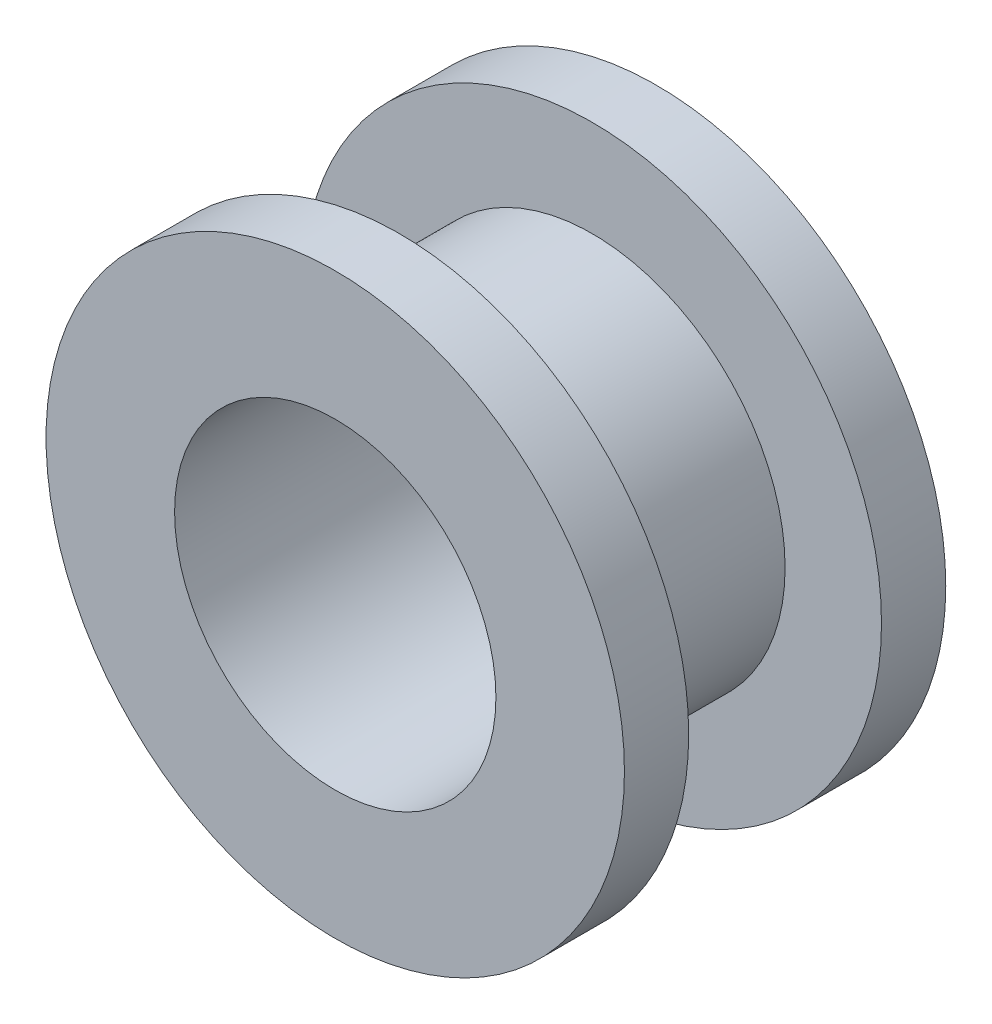
ISO-10303-21;
HEADER;
FILE_DESCRIPTION(('STEP AP214'),'2;1');
FILE_NAME('part.step','',(''),(''),'','','');
FILE_SCHEMA(('AUTOMOTIVE_DESIGN { 1 0 10303 214 1 1 1 1 }'));
ENDSEC;
DATA;
#1=APPLICATION_CONTEXT('core data for automotive mechanical design processes');
#2=APPLICATION_PROTOCOL_DEFINITION('international standard','automotive_design',2000,#1);
#3=PRODUCT_CONTEXT('',#1,'mechanical');
#4=PRODUCT('Part','Part','',(#3));
#5=PRODUCT_RELATED_PRODUCT_CATEGORY('part','',(#4));
#6=PRODUCT_DEFINITION_FORMATION('','',#4);
#7=PRODUCT_DEFINITION_CONTEXT('part definition',#1,'design');
#8=PRODUCT_DEFINITION('design','',#6,#7);
#9=PRODUCT_DEFINITION_SHAPE('','',#8);
#10=(LENGTH_UNIT() NAMED_UNIT(*) SI_UNIT(.MILLI.,.METRE.));
#11=(NAMED_UNIT(*) PLANE_ANGLE_UNIT() SI_UNIT($,.RADIAN.));
#12=(NAMED_UNIT(*) SI_UNIT($,.STERADIAN.) SOLID_ANGLE_UNIT());
#13=UNCERTAINTY_MEASURE_WITH_UNIT(LENGTH_MEASURE(1.E-05),#10,'distance_accuracy_value','');
#14=(GEOMETRIC_REPRESENTATION_CONTEXT(3) GLOBAL_UNCERTAINTY_ASSIGNED_CONTEXT((#13)) GLOBAL_UNIT_ASSIGNED_CONTEXT((#10,
#11,#12)) REPRESENTATION_CONTEXT('',''));
#15=CARTESIAN_POINT('',(0.,0.,0.));
#16=DIRECTION('',(0.,0.,1.));
#17=DIRECTION('',(1.,0.,0.));
#18=AXIS2_PLACEMENT_3D('',#15,#16,#17);
#19=CARTESIAN_POINT('',(-4.92551999338994E-12,118.250000000001,26.9705627484773));
#20=DIRECTION('',(0.,0.,-1.));
#21=DIRECTION('',(-1.,0.,0.));
#22=AXIS2_PLACEMENT_3D('',#19,#20,#21);
#23=CYLINDRICAL_SURFACE('',#22,6.);
#24=CARTESIAN_POINT('',(-4.92551999338994E-12,118.250000000001,2.));
#25=DIRECTION('',(0.,0.,1.));
#26=DIRECTION('',(1.,0.,0.));
#27=AXIS2_PLACEMENT_3D('',#24,#25,#26);
#28=CIRCLE('',#27,6.);
#29=CARTESIAN_POINT('',(5.99999999999508,118.250000000001,2.));
#30=VERTEX_POINT('',#29);
#31=EDGE_CURVE('E54',#30,#30,#28,.T.);
#32=ORIENTED_EDGE('',*,*,#31,.T.);
#33=EDGE_LOOP('',(#32));
#34=FACE_BOUND('',#33,.T.);
#35=CARTESIAN_POINT('',(-4.92551999338994E-12,118.250000000001,8.00000000000013));
#36=DIRECTION('',(0.,0.,1.));
#37=DIRECTION('',(1.,0.,0.));
#38=AXIS2_PLACEMENT_3D('',#35,#36,#37);
#39=CIRCLE('',#38,6.);
#40=CARTESIAN_POINT('',(5.99999999999508,118.250000000001,8.00000000000013));
#41=VERTEX_POINT('',#40);
#42=EDGE_CURVE('E10',#41,#41,#39,.T.);
#43=ORIENTED_EDGE('',*,*,#42,.F.);
#44=EDGE_LOOP('',(#43));
#45=FACE_BOUND('',#44,.T.);
#46=ADVANCED_FACE('F31',(#34,#45),#23,.T.);
#47=CARTESIAN_POINT('',(-4.92551999338994E-12,118.250000000001,2.));
#48=DIRECTION('',(0.,0.,1.));
#49=DIRECTION('',(1.,0.,0.));
#50=AXIS2_PLACEMENT_3D('',#47,#48,#49);
#51=PLANE('',#50);
#52=CARTESIAN_POINT('',(-4.92551999338994E-12,118.250000000001,2.));
#53=DIRECTION('',(0.,0.,1.));
#54=DIRECTION('',(1.,0.,0.));
#55=AXIS2_PLACEMENT_3D('',#52,#53,#54);
#56=CIRCLE('',#55,9.);
#57=CARTESIAN_POINT('',(8.99999999999507,118.250000000001,2.));
#58=VERTEX_POINT('',#57);
#59=EDGE_CURVE('E38',#58,#58,#56,.T.);
#60=ORIENTED_EDGE('',*,*,#59,.T.);
#61=EDGE_LOOP('',(#60));
#62=FACE_BOUND('',#61,.T.);
#63=ORIENTED_EDGE('',*,*,#31,.F.);
#64=EDGE_LOOP('',(#63));
#65=FACE_BOUND('',#64,.T.);
#66=ADVANCED_FACE('F76',(#62,#65),#51,.T.);
#67=CARTESIAN_POINT('',(-4.92551999338994E-12,118.250000000001,0.));
#68=DIRECTION('',(0.,0.,1.));
#69=DIRECTION('',(1.,0.,0.));
#70=AXIS2_PLACEMENT_3D('',#67,#68,#69);
#71=PLANE('',#70);
#72=CARTESIAN_POINT('',(-4.92551999338994E-12,118.250000000001,0.));
#73=DIRECTION('',(0.,0.,1.));
#74=DIRECTION('',(1.,0.,0.));
#75=AXIS2_PLACEMENT_3D('',#72,#73,#74);
#76=CIRCLE('',#75,9.);
#77=CARTESIAN_POINT('',(8.99999999999507,118.250000000001,0.));
#78=VERTEX_POINT('',#77);
#79=EDGE_CURVE('E42',#78,#78,#76,.T.);
#80=ORIENTED_EDGE('',*,*,#79,.F.);
#81=EDGE_LOOP('',(#80));
#82=FACE_BOUND('',#81,.T.);
#83=CARTESIAN_POINT('',(-4.92551999338994E-12,118.250000000001,0.));
#84=DIRECTION('',(0.,0.,1.));
#85=DIRECTION('',(1.,0.,0.));
#86=AXIS2_PLACEMENT_3D('',#83,#84,#85);
#87=CIRCLE('',#86,5.);
#88=CARTESIAN_POINT('',(4.99999999999508,118.250000000001,0.));
#89=VERTEX_POINT('',#88);
#90=EDGE_CURVE('E47',#89,#89,#87,.T.);
#91=ORIENTED_EDGE('',*,*,#90,.T.);
#92=EDGE_LOOP('',(#91));
#93=FACE_BOUND('',#92,.T.);
#94=ADVANCED_FACE('F82',(#82,#93),#71,.F.);
#95=CARTESIAN_POINT('',(-4.92551999338994E-12,118.250000000001,2.));
#96=DIRECTION('',(0.,0.,-1.));
#97=DIRECTION('',(-1.,0.,0.));
#98=AXIS2_PLACEMENT_3D('',#95,#96,#97);
#99=CYLINDRICAL_SURFACE('',#98,9.);
#100=ORIENTED_EDGE('',*,*,#59,.F.);
#101=EDGE_LOOP('',(#100));
#102=FACE_BOUND('',#101,.T.);
#103=ORIENTED_EDGE('',*,*,#79,.T.);
#104=EDGE_LOOP('',(#103));
#105=FACE_BOUND('',#104,.T.);
#106=ADVANCED_FACE('F33',(#102,#105),#99,.T.);
#107=CARTESIAN_POINT('',(-4.92551999338994E-12,118.250000000001,2.));
#108=DIRECTION('',(0.,0.,-1.));
#109=DIRECTION('',(-1.,0.,0.));
#110=AXIS2_PLACEMENT_3D('',#107,#108,#109);
#111=CYLINDRICAL_SURFACE('',#110,5.);
#112=CARTESIAN_POINT('',(-4.92551999338994E-12,118.250000000001,10.0000000000001));
#113=DIRECTION('',(0.,0.,-1.));
#114=DIRECTION('',(-1.,0.,0.));
#115=AXIS2_PLACEMENT_3D('',#112,#113,#114);
#116=CIRCLE('',#115,5.);
#117=CARTESIAN_POINT('',(-5.00000000000493,118.250000000001,10.0000000000001));
#118=VERTEX_POINT('',#117);
#119=EDGE_CURVE('E51',#118,#118,#116,.T.);
#120=ORIENTED_EDGE('',*,*,#119,.F.);
#121=EDGE_LOOP('',(#120));
#122=FACE_BOUND('',#121,.T.);
#123=ORIENTED_EDGE('',*,*,#90,.F.);
#124=EDGE_LOOP('',(#123));
#125=FACE_BOUND('',#124,.T.);
#126=ADVANCED_FACE('F88',(#122,#125),#111,.F.);
#127=CARTESIAN_POINT('',(9.91999999999988,106.,10.0000000000001));
#128=DIRECTION('',(0.,0.,-1.));
#129=DIRECTION('',(0.,1.,0.));
#130=AXIS2_PLACEMENT_3D('',#127,#128,#129);
#131=PLANE('',#130);
#132=ORIENTED_EDGE('',*,*,#119,.T.);
#133=EDGE_LOOP('',(#132));
#134=FACE_BOUND('',#133,.T.);
#135=CARTESIAN_POINT('',(1.0524141069853E-12,118.25,10.0000000000001));
#136=DIRECTION('',(0.,0.,1.));
#137=DIRECTION('',(1.,0.,0.));
#138=AXIS2_PLACEMENT_3D('',#135,#136,#137);
#139=CIRCLE('',#138,8.9999999999945);
#140=CARTESIAN_POINT('',(8.99999999999555,118.25,10.0000000000001));
#141=VERTEX_POINT('',#140);
#142=EDGE_CURVE('E58',#141,#141,#139,.T.);
#143=ORIENTED_EDGE('',*,*,#142,.T.);
#144=EDGE_LOOP('',(#143));
#145=FACE_BOUND('',#144,.T.);
#146=ADVANCED_FACE('F73',(#134,#145),#131,.F.);
#147=CARTESIAN_POINT('',(1.0524141069853E-12,118.25,8.00000000000013));
#148=DIRECTION('',(0.,0.,1.));
#149=DIRECTION('',(1.,0.,0.));
#150=AXIS2_PLACEMENT_3D('',#147,#148,#149);
#151=CYLINDRICAL_SURFACE('',#150,8.9999999999945);
#152=CARTESIAN_POINT('',(1.0524141069853E-12,118.25,8.00000000000013));
#153=DIRECTION('',(0.,0.,1.));
#154=DIRECTION('',(1.,0.,0.));
#155=AXIS2_PLACEMENT_3D('',#152,#153,#154);
#156=CIRCLE('',#155,8.9999999999945);
#157=CARTESIAN_POINT('',(8.99999999999555,118.25,8.00000000000013));
#158=VERTEX_POINT('',#157);
#159=EDGE_CURVE('E57',#158,#158,#156,.T.);
#160=ORIENTED_EDGE('',*,*,#159,.T.);
#161=EDGE_LOOP('',(#160));
#162=FACE_BOUND('',#161,.T.);
#163=ORIENTED_EDGE('',*,*,#142,.F.);
#164=EDGE_LOOP('',(#163));
#165=FACE_BOUND('',#164,.T.);
#166=ADVANCED_FACE('F64',(#162,#165),#151,.T.);
#167=CARTESIAN_POINT('',(1.0524141069853E-12,118.25,8.00000000000013));
#168=DIRECTION('',(0.,0.,1.));
#169=DIRECTION('',(1.,0.,0.));
#170=AXIS2_PLACEMENT_3D('',#167,#168,#169);
#171=PLANE('',#170);
#172=ORIENTED_EDGE('',*,*,#42,.T.);
#173=EDGE_LOOP('',(#172));
#174=FACE_BOUND('',#173,.T.);
#175=ORIENTED_EDGE('',*,*,#159,.F.);
#176=EDGE_LOOP('',(#175));
#177=FACE_BOUND('',#176,.T.);
#178=ADVANCED_FACE('F67',(#174,#177),#171,.F.);
#179=CLOSED_SHELL('',(#46,#66,#94,#106,#126,#146,#166,#178));
#180=MANIFOLD_SOLID_BREP('B2',#179);
#181=ADVANCED_BREP_SHAPE_REPRESENTATION('',(#18,#180),#14);
#182=SHAPE_DEFINITION_REPRESENTATION(#9,#181);
ENDSEC;
END-ISO-10303-21;
